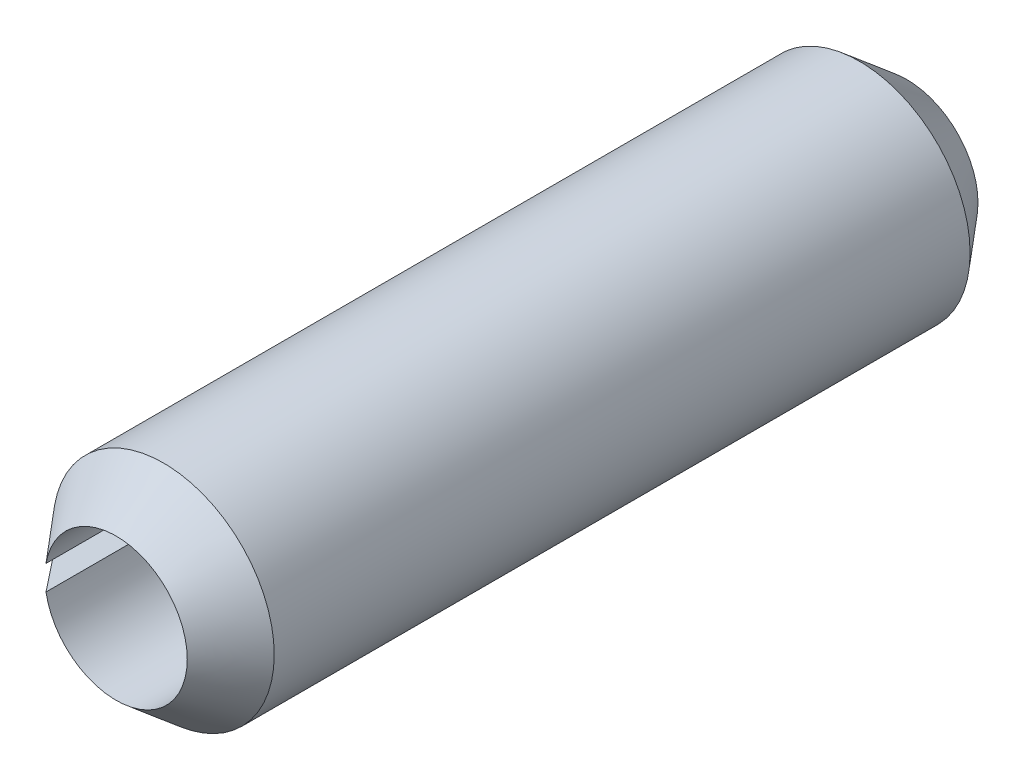
ISO-10303-21;
HEADER;
FILE_DESCRIPTION(('STEP AP214'),'2;1');
FILE_NAME('part.step','',(''),(''),'','','');
FILE_SCHEMA(('AUTOMOTIVE_DESIGN { 1 0 10303 214 1 1 1 1 }'));
ENDSEC;
DATA;
#1=APPLICATION_CONTEXT('core data for automotive mechanical design processes');
#2=APPLICATION_PROTOCOL_DEFINITION('international standard','automotive_design',2000,#1);
#3=PRODUCT_CONTEXT('',#1,'mechanical');
#4=PRODUCT('Part','Part','',(#3));
#5=PRODUCT_RELATED_PRODUCT_CATEGORY('part','',(#4));
#6=PRODUCT_DEFINITION_FORMATION('','',#4);
#7=PRODUCT_DEFINITION_CONTEXT('part definition',#1,'design');
#8=PRODUCT_DEFINITION('design','',#6,#7);
#9=PRODUCT_DEFINITION_SHAPE('','',#8);
#10=(LENGTH_UNIT() NAMED_UNIT(*) SI_UNIT(.MILLI.,.METRE.));
#11=(NAMED_UNIT(*) PLANE_ANGLE_UNIT() SI_UNIT($,.RADIAN.));
#12=(NAMED_UNIT(*) SI_UNIT($,.STERADIAN.) SOLID_ANGLE_UNIT());
#13=UNCERTAINTY_MEASURE_WITH_UNIT(LENGTH_MEASURE(1.E-05),#10,'distance_accuracy_value','');
#14=(GEOMETRIC_REPRESENTATION_CONTEXT(3) GLOBAL_UNCERTAINTY_ASSIGNED_CONTEXT((#13)) GLOBAL_UNIT_ASSIGNED_CONTEXT((#10,
#11,#12)) REPRESENTATION_CONTEXT('',''));
#15=CARTESIAN_POINT('',(0.,0.,0.));
#16=DIRECTION('',(0.,0.,1.));
#17=DIRECTION('',(1.,0.,0.));
#18=AXIS2_PLACEMENT_3D('',#15,#16,#17);
#19=CARTESIAN_POINT('',(0.,0.,5.));
#20=DIRECTION('',(0.,0.,-1.));
#21=DIRECTION('',(-1.,0.,0.));
#22=AXIS2_PLACEMENT_3D('',#19,#20,#21);
#23=CYLINDRICAL_SURFACE('',#22,0.9);
#24=CARTESIAN_POINT('',(0.,0.,-5.));
#25=DIRECTION('',(0.,0.,-1.));
#26=DIRECTION('',(1.,0.,0.));
#27=AXIS2_PLACEMENT_3D('',#24,#25,#26);
#28=CIRCLE('',#27,0.9);
#29=CARTESIAN_POINT('',(-0.886326977710989,0.156283359900234,-5.));
#30=VERTEX_POINT('',#29);
#31=CARTESIAN_POINT('',(-0.886326977710988,-0.156283359900234,-5.));
#32=VERTEX_POINT('',#31);
#33=EDGE_CURVE('E93',#30,#32,#28,.T.);
#34=ORIENTED_EDGE('',*,*,#33,.T.);
#35=DIRECTION('',(0.,0.,-1.));
#36=VECTOR('',#35,1.);
#37=CARTESIAN_POINT('',(-0.886326977710988,-0.156283359900234,5.));
#38=LINE('',#37,#36);
#39=CARTESIAN_POINT('',(-0.88632697771099,-0.156283359900235,5.));
#40=VERTEX_POINT('',#39);
#41=EDGE_CURVE('E11',#40,#32,#38,.T.);
#42=ORIENTED_EDGE('',*,*,#41,.F.);
#43=CARTESIAN_POINT('',(0.,0.,5.));
#44=DIRECTION('',(0.,0.,-1.));
#45=DIRECTION('',(1.,0.,0.));
#46=AXIS2_PLACEMENT_3D('',#43,#44,#45);
#47=CIRCLE('',#46,0.9);
#48=CARTESIAN_POINT('',(-0.886326977710988,0.156283359900234,5.));
#49=VERTEX_POINT('',#48);
#50=EDGE_CURVE('E90',#49,#40,#47,.T.);
#51=ORIENTED_EDGE('',*,*,#50,.F.);
#52=DIRECTION('',(0.,0.,-1.));
#53=VECTOR('',#52,1.);
#54=CARTESIAN_POINT('',(-0.886326977710988,0.156283359900234,5.));
#55=LINE('',#54,#53);
#56=EDGE_CURVE('E82',#49,#30,#55,.T.);
#57=ORIENTED_EDGE('',*,*,#56,.T.);
#58=EDGE_LOOP('',(#34,#42,#51,#57));
#59=FACE_BOUND('',#58,.T.);
#60=ADVANCED_FACE('F34',(#59),#23,.F.);
#61=CARTESIAN_POINT('',(-0.886326977710988,-0.156283359900234,5.));
#62=DIRECTION('',(0.173648177666928,-0.984807753012209,0.));
#63=DIRECTION('',(0.984807753012209,0.173648177666928,0.));
#64=AXIS2_PLACEMENT_3D('',#61,#62,#63);
#65=PLANE('',#64);
#66=DIRECTION('',(0.,0.,-1.));
#67=VECTOR('',#66,1.);
#68=CARTESIAN_POINT('',(-1.37873085421709,-0.243107448733698,5.));
#69=LINE('',#68,#67);
#70=CARTESIAN_POINT('',(-1.3787308542171,-0.243107448733698,4.4));
#71=VERTEX_POINT('',#70);
#72=CARTESIAN_POINT('',(-1.3787308542171,-0.243107448733698,-4.4));
#73=VERTEX_POINT('',#72);
#74=EDGE_CURVE('E42',#71,#73,#69,.T.);
#75=ORIENTED_EDGE('',*,*,#74,.F.);
#76=DIRECTION('',(-0.630458560147046,-0.111166854372533,-0.768221279597376));
#77=VECTOR('',#76,1.);
#78=CARTESIAN_POINT('',(0.,0.,6.08));
#79=LINE('',#78,#77);
#80=EDGE_CURVE('E71',#71,#40,#79,.F.);
#81=ORIENTED_EDGE('',*,*,#80,.T.);
#82=ORIENTED_EDGE('',*,*,#41,.T.);
#83=DIRECTION('',(0.630458560147046,0.111166854372533,-0.768221279597376));
#84=VECTOR('',#83,1.);
#85=CARTESIAN_POINT('',(0.,0.,-6.08));
#86=LINE('',#85,#84);
#87=EDGE_CURVE('E96',#32,#73,#86,.F.);
#88=ORIENTED_EDGE('',*,*,#87,.T.);
#89=EDGE_LOOP('',(#75,#81,#82,#88));
#90=FACE_BOUND('',#89,.T.);
#91=ADVANCED_FACE('F105',(#90),#65,.F.);
#92=CARTESIAN_POINT('',(0.,0.,5.));
#93=DIRECTION('',(0.,0.,-1.));
#94=DIRECTION('',(-1.,0.,0.));
#95=AXIS2_PLACEMENT_3D('',#92,#93,#94);
#96=CYLINDRICAL_SURFACE('',#95,1.4);
#97=DIRECTION('',(0.,0.,-1.));
#98=VECTOR('',#97,1.);
#99=CARTESIAN_POINT('',(-1.37873085421709,0.243107448733698,5.));
#100=LINE('',#99,#98);
#101=CARTESIAN_POINT('',(-1.37873085421709,0.243107448733698,4.4));
#102=VERTEX_POINT('',#101);
#103=CARTESIAN_POINT('',(-1.37873085421709,0.243107448733698,-4.4));
#104=VERTEX_POINT('',#103);
#105=EDGE_CURVE('E79',#102,#104,#100,.T.);
#106=ORIENTED_EDGE('',*,*,#105,.F.);
#107=CARTESIAN_POINT('',(0.,0.,4.4));
#108=DIRECTION('',(0.,0.,-1.));
#109=DIRECTION('',(-1.,0.,0.));
#110=AXIS2_PLACEMENT_3D('',#107,#108,#109);
#111=CIRCLE('',#110,1.4);
#112=EDGE_CURVE('E68',#102,#71,#111,.T.);
#113=ORIENTED_EDGE('',*,*,#112,.T.);
#114=ORIENTED_EDGE('',*,*,#74,.T.);
#115=CARTESIAN_POINT('',(0.,0.,-4.4));
#116=DIRECTION('',(0.,0.,-1.));
#117=DIRECTION('',(-1.,0.,0.));
#118=AXIS2_PLACEMENT_3D('',#115,#116,#117);
#119=CIRCLE('',#118,1.4);
#120=EDGE_CURVE('E88',#104,#73,#119,.T.);
#121=ORIENTED_EDGE('',*,*,#120,.F.);
#122=EDGE_LOOP('',(#106,#113,#114,#121));
#123=FACE_BOUND('',#122,.T.);
#124=ADVANCED_FACE('F86',(#123),#96,.T.);
#125=CARTESIAN_POINT('',(-1.37873085421709,0.243107448733698,5.));
#126=DIRECTION('',(0.173648177666928,0.984807753012209,0.));
#127=DIRECTION('',(-0.984807753012209,0.173648177666928,0.));
#128=AXIS2_PLACEMENT_3D('',#125,#126,#127);
#129=PLANE('',#128);
#130=ORIENTED_EDGE('',*,*,#56,.F.);
#131=DIRECTION('',(0.630458560147046,-0.111166854372533,0.768221279597376));
#132=VECTOR('',#131,1.);
#133=CARTESIAN_POINT('',(0.,0.,6.08));
#134=LINE('',#133,#132);
#135=EDGE_CURVE('E48',#49,#102,#134,.F.);
#136=ORIENTED_EDGE('',*,*,#135,.T.);
#137=ORIENTED_EDGE('',*,*,#105,.T.);
#138=DIRECTION('',(-0.630458560147046,0.111166854372533,0.768221279597376));
#139=VECTOR('',#138,1.);
#140=CARTESIAN_POINT('',(0.,0.,-6.08));
#141=LINE('',#140,#139);
#142=EDGE_CURVE('E100',#104,#30,#141,.F.);
#143=ORIENTED_EDGE('',*,*,#142,.T.);
#144=EDGE_LOOP('',(#130,#136,#137,#143));
#145=FACE_BOUND('',#144,.T.);
#146=ADVANCED_FACE('F77',(#145),#129,.F.);
#147=CARTESIAN_POINT('',(0.,0.,-4.4));
#148=DIRECTION('',(0.,0.,1.));
#149=DIRECTION('',(1.,0.,0.));
#150=AXIS2_PLACEMENT_3D('',#147,#148,#149);
#151=CONICAL_SURFACE('',#150,1.4,0.694738276196703);
#152=ORIENTED_EDGE('',*,*,#33,.F.);
#153=ORIENTED_EDGE('',*,*,#142,.F.);
#154=ORIENTED_EDGE('',*,*,#120,.T.);
#155=ORIENTED_EDGE('',*,*,#87,.F.);
#156=EDGE_LOOP('',(#152,#153,#154,#155));
#157=FACE_BOUND('',#156,.T.);
#158=ADVANCED_FACE('F108',(#157),#151,.T.);
#159=CARTESIAN_POINT('',(0.,0.,5.));
#160=DIRECTION('',(0.,0.,-1.));
#161=DIRECTION('',(-1.,0.,0.));
#162=AXIS2_PLACEMENT_3D('',#159,#160,#161);
#163=CONICAL_SURFACE('',#162,0.900000000000001,0.694738276196703);
#164=ORIENTED_EDGE('',*,*,#112,.F.);
#165=ORIENTED_EDGE('',*,*,#135,.F.);
#166=ORIENTED_EDGE('',*,*,#50,.T.);
#167=ORIENTED_EDGE('',*,*,#80,.F.);
#168=EDGE_LOOP('',(#164,#165,#166,#167));
#169=FACE_BOUND('',#168,.T.);
#170=ADVANCED_FACE('F69',(#169),#163,.T.);
#171=CLOSED_SHELL('',(#60,#91,#124,#146,#158,#170));
#172=MANIFOLD_SOLID_BREP('B2',#171);
#173=ADVANCED_BREP_SHAPE_REPRESENTATION('',(#18,#172),#14);
#174=SHAPE_DEFINITION_REPRESENTATION(#9,#173);
ENDSEC;
END-ISO-10303-21;
